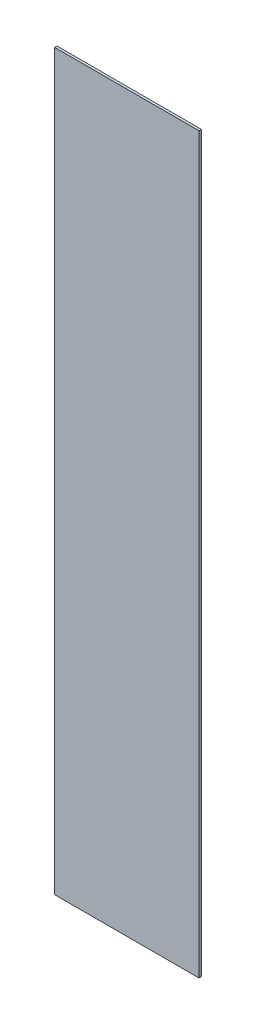
ISO-10303-21;
HEADER;
FILE_DESCRIPTION(('STEP AP214'),'2;1');
FILE_NAME('part.step','',(''),(''),'','','');
FILE_SCHEMA(('AUTOMOTIVE_DESIGN { 1 0 10303 214 1 1 1 1 }'));
ENDSEC;
DATA;
#1=APPLICATION_CONTEXT('core data for automotive mechanical design processes');
#2=APPLICATION_PROTOCOL_DEFINITION('international standard','automotive_design',2000,#1);
#3=PRODUCT_CONTEXT('',#1,'mechanical');
#4=PRODUCT('Part','Part','',(#3));
#5=PRODUCT_RELATED_PRODUCT_CATEGORY('part','',(#4));
#6=PRODUCT_DEFINITION_FORMATION('','',#4);
#7=PRODUCT_DEFINITION_CONTEXT('part definition',#1,'design');
#8=PRODUCT_DEFINITION('design','',#6,#7);
#9=PRODUCT_DEFINITION_SHAPE('','',#8);
#10=(LENGTH_UNIT() NAMED_UNIT(*) SI_UNIT(.MILLI.,.METRE.));
#11=(NAMED_UNIT(*) PLANE_ANGLE_UNIT() SI_UNIT($,.RADIAN.));
#12=(NAMED_UNIT(*) SI_UNIT($,.STERADIAN.) SOLID_ANGLE_UNIT());
#13=UNCERTAINTY_MEASURE_WITH_UNIT(LENGTH_MEASURE(1.E-05),#10,'distance_accuracy_value','');
#14=(GEOMETRIC_REPRESENTATION_CONTEXT(3) GLOBAL_UNCERTAINTY_ASSIGNED_CONTEXT((#13)) GLOBAL_UNIT_ASSIGNED_CONTEXT((#10,
#11,#12)) REPRESENTATION_CONTEXT('',''));
#15=CARTESIAN_POINT('',(0.,0.,0.));
#16=DIRECTION('',(0.,0.,1.));
#17=DIRECTION('',(1.,0.,0.));
#18=AXIS2_PLACEMENT_3D('',#15,#16,#17);
#19=CARTESIAN_POINT('',(60.,305.,2.));
#20=DIRECTION('',(-1.,0.,0.));
#21=DIRECTION('',(0.,-1.,0.));
#22=AXIS2_PLACEMENT_3D('',#19,#20,#21);
#23=PLANE('',#22);
#24=DIRECTION('',(0.,1.,0.));
#25=VECTOR('',#24,1.);
#26=CARTESIAN_POINT('',(60.,305.,0.));
#27=LINE('',#26,#25);
#28=CARTESIAN_POINT('',(60.,-305.,0.));
#29=VERTEX_POINT('',#28);
#30=CARTESIAN_POINT('',(60.,305.,0.));
#31=VERTEX_POINT('',#30);
#32=EDGE_CURVE('E98',#29,#31,#27,.T.);
#33=ORIENTED_EDGE('',*,*,#32,.T.);
#34=DIRECTION('',(0.,0.,-1.));
#35=VECTOR('',#34,1.);
#36=CARTESIAN_POINT('',(60.,305.,2.));
#37=LINE('',#36,#35);
#38=CARTESIAN_POINT('',(60.,305.,2.));
#39=VERTEX_POINT('',#38);
#40=EDGE_CURVE('E11',#39,#31,#37,.T.);
#41=ORIENTED_EDGE('',*,*,#40,.F.);
#42=DIRECTION('',(0.,1.,0.));
#43=VECTOR('',#42,1.);
#44=CARTESIAN_POINT('',(60.,305.,2.));
#45=LINE('',#44,#43);
#46=CARTESIAN_POINT('',(60.,-305.,2.));
#47=VERTEX_POINT('',#46);
#48=EDGE_CURVE('E86',#47,#39,#45,.T.);
#49=ORIENTED_EDGE('',*,*,#48,.F.);
#50=DIRECTION('',(0.,0.,-1.));
#51=VECTOR('',#50,1.);
#52=CARTESIAN_POINT('',(60.,-305.,2.));
#53=LINE('',#52,#51);
#54=EDGE_CURVE('E94',#47,#29,#53,.T.);
#55=ORIENTED_EDGE('',*,*,#54,.T.);
#56=EDGE_LOOP('',(#33,#41,#49,#55));
#57=FACE_BOUND('',#56,.T.);
#58=ADVANCED_FACE('F35',(#57),#23,.F.);
#59=CARTESIAN_POINT('',(-60.,305.,2.));
#60=DIRECTION('',(0.,-1.,0.));
#61=DIRECTION('',(0.,0.,-1.));
#62=AXIS2_PLACEMENT_3D('',#59,#60,#61);
#63=PLANE('',#62);
#64=DIRECTION('',(-1.,0.,0.));
#65=VECTOR('',#64,1.);
#66=CARTESIAN_POINT('',(-60.,305.,0.));
#67=LINE('',#66,#65);
#68=CARTESIAN_POINT('',(-60.,305.,0.));
#69=VERTEX_POINT('',#68);
#70=EDGE_CURVE('E90',#31,#69,#67,.T.);
#71=ORIENTED_EDGE('',*,*,#70,.T.);
#72=DIRECTION('',(0.,0.,-1.));
#73=VECTOR('',#72,1.);
#74=CARTESIAN_POINT('',(-60.,305.,2.));
#75=LINE('',#74,#73);
#76=CARTESIAN_POINT('',(-60.,305.,2.));
#77=VERTEX_POINT('',#76);
#78=EDGE_CURVE('E43',#77,#69,#75,.T.);
#79=ORIENTED_EDGE('',*,*,#78,.F.);
#80=DIRECTION('',(-1.,0.,0.));
#81=VECTOR('',#80,1.);
#82=CARTESIAN_POINT('',(-60.,305.,2.));
#83=LINE('',#82,#81);
#84=EDGE_CURVE('E81',#39,#77,#83,.T.);
#85=ORIENTED_EDGE('',*,*,#84,.F.);
#86=ORIENTED_EDGE('',*,*,#40,.T.);
#87=EDGE_LOOP('',(#71,#79,#85,#86));
#88=FACE_BOUND('',#87,.T.);
#89=ADVANCED_FACE('F89',(#88),#63,.F.);
#90=CARTESIAN_POINT('',(-60.,305.,2.));
#91=DIRECTION('',(1.,0.,0.));
#92=DIRECTION('',(0.,1.,0.));
#93=AXIS2_PLACEMENT_3D('',#90,#91,#92);
#94=PLANE('',#93);
#95=DIRECTION('',(0.,-1.,0.));
#96=VECTOR('',#95,1.);
#97=CARTESIAN_POINT('',(-60.,305.,0.));
#98=LINE('',#97,#96);
#99=CARTESIAN_POINT('',(-60.,-305.,0.));
#100=VERTEX_POINT('',#99);
#101=EDGE_CURVE('E68',#69,#100,#98,.T.);
#102=ORIENTED_EDGE('',*,*,#101,.T.);
#103=DIRECTION('',(0.,0.,-1.));
#104=VECTOR('',#103,1.);
#105=CARTESIAN_POINT('',(-60.,-305.,2.));
#106=LINE('',#105,#104);
#107=CARTESIAN_POINT('',(-60.,-305.,2.));
#108=VERTEX_POINT('',#107);
#109=EDGE_CURVE('E91',#108,#100,#106,.T.);
#110=ORIENTED_EDGE('',*,*,#109,.F.);
#111=DIRECTION('',(0.,-1.,0.));
#112=VECTOR('',#111,1.);
#113=CARTESIAN_POINT('',(-60.,305.,2.));
#114=LINE('',#113,#112);
#115=EDGE_CURVE('E84',#77,#108,#114,.T.);
#116=ORIENTED_EDGE('',*,*,#115,.F.);
#117=ORIENTED_EDGE('',*,*,#78,.T.);
#118=EDGE_LOOP('',(#102,#110,#116,#117));
#119=FACE_BOUND('',#118,.T.);
#120=ADVANCED_FACE('F92',(#119),#94,.F.);
#121=CARTESIAN_POINT('',(-60.,-305.,2.));
#122=DIRECTION('',(0.,1.,0.));
#123=DIRECTION('',(0.,0.,1.));
#124=AXIS2_PLACEMENT_3D('',#121,#122,#123);
#125=PLANE('',#124);
#126=DIRECTION('',(1.,0.,0.));
#127=VECTOR('',#126,1.);
#128=CARTESIAN_POINT('',(-60.,-305.,0.));
#129=LINE('',#128,#127);
#130=EDGE_CURVE('E74',#100,#29,#129,.T.);
#131=ORIENTED_EDGE('',*,*,#130,.T.);
#132=ORIENTED_EDGE('',*,*,#54,.F.);
#133=DIRECTION('',(1.,0.,0.));
#134=VECTOR('',#133,1.);
#135=CARTESIAN_POINT('',(-60.,-305.,2.));
#136=LINE('',#135,#134);
#137=EDGE_CURVE('E51',#108,#47,#136,.T.);
#138=ORIENTED_EDGE('',*,*,#137,.F.);
#139=ORIENTED_EDGE('',*,*,#109,.T.);
#140=EDGE_LOOP('',(#131,#132,#138,#139));
#141=FACE_BOUND('',#140,.T.);
#142=ADVANCED_FACE('F105',(#141),#125,.F.);
#143=CARTESIAN_POINT('',(0.,0.,2.));
#144=DIRECTION('',(0.,0.,1.));
#145=DIRECTION('',(1.,0.,0.));
#146=AXIS2_PLACEMENT_3D('',#143,#144,#145);
#147=PLANE('',#146);
#148=ORIENTED_EDGE('',*,*,#48,.T.);
#149=ORIENTED_EDGE('',*,*,#84,.T.);
#150=ORIENTED_EDGE('',*,*,#115,.T.);
#151=ORIENTED_EDGE('',*,*,#137,.T.);
#152=EDGE_LOOP('',(#148,#149,#150,#151));
#153=FACE_BOUND('',#152,.T.);
#154=ADVANCED_FACE('F82',(#153),#147,.T.);
#155=CARTESIAN_POINT('',(0.,0.,0.));
#156=DIRECTION('',(0.,0.,1.));
#157=DIRECTION('',(1.,0.,0.));
#158=AXIS2_PLACEMENT_3D('',#155,#156,#157);
#159=PLANE('',#158);
#160=ORIENTED_EDGE('',*,*,#32,.F.);
#161=ORIENTED_EDGE('',*,*,#130,.F.);
#162=ORIENTED_EDGE('',*,*,#101,.F.);
#163=ORIENTED_EDGE('',*,*,#70,.F.);
#164=EDGE_LOOP('',(#160,#161,#162,#163));
#165=FACE_BOUND('',#164,.T.);
#166=ADVANCED_FACE('F108',(#165),#159,.F.);
#167=CLOSED_SHELL('',(#58,#89,#120,#142,#154,#166));
#168=MANIFOLD_SOLID_BREP('B2',#167);
#169=ADVANCED_BREP_SHAPE_REPRESENTATION('',(#18,#168),#14);
#170=SHAPE_DEFINITION_REPRESENTATION(#9,#169);
ENDSEC;
END-ISO-10303-21;
